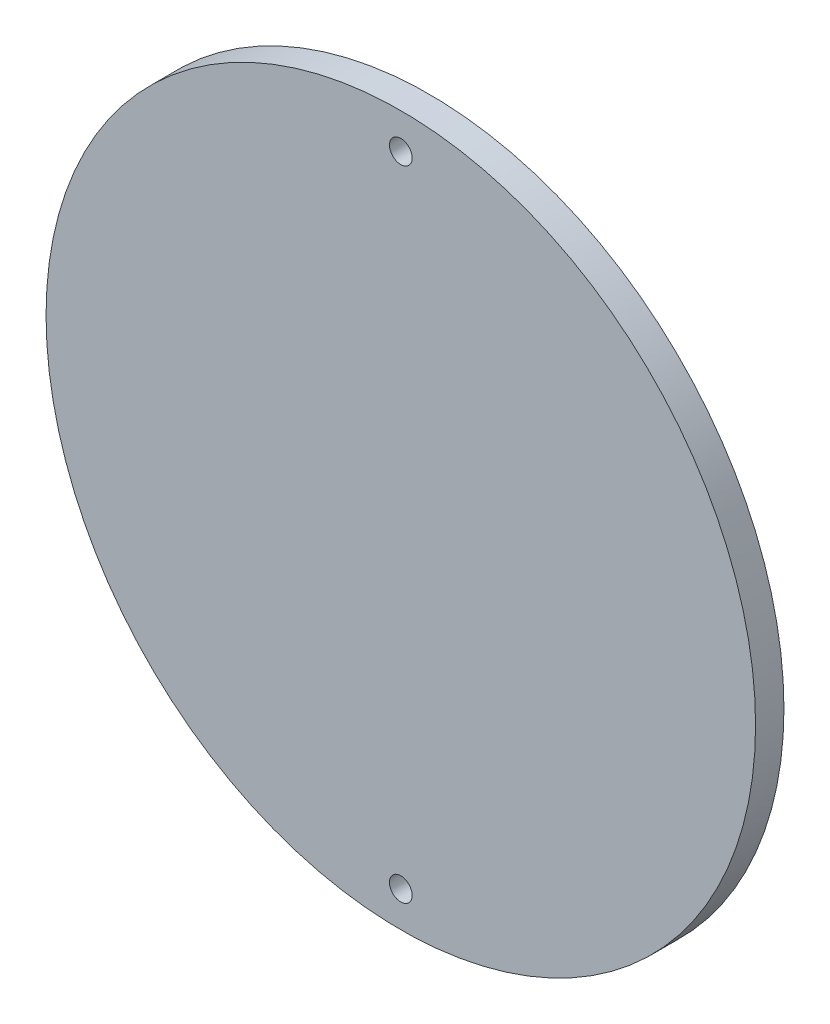
ISO-10303-21;
HEADER;
FILE_DESCRIPTION(('STEP AP214'),'2;1');
FILE_NAME('part.step','',(''),(''),'','','');
FILE_SCHEMA(('AUTOMOTIVE_DESIGN { 1 0 10303 214 1 1 1 1 }'));
ENDSEC;
DATA;
#1=APPLICATION_CONTEXT('core data for automotive mechanical design processes');
#2=APPLICATION_PROTOCOL_DEFINITION('international standard','automotive_design',2000,#1);
#3=PRODUCT_CONTEXT('',#1,'mechanical');
#4=PRODUCT('Part','Part','',(#3));
#5=PRODUCT_RELATED_PRODUCT_CATEGORY('part','',(#4));
#6=PRODUCT_DEFINITION_FORMATION('','',#4);
#7=PRODUCT_DEFINITION_CONTEXT('part definition',#1,'design');
#8=PRODUCT_DEFINITION('design','',#6,#7);
#9=PRODUCT_DEFINITION_SHAPE('','',#8);
#10=(LENGTH_UNIT() NAMED_UNIT(*) SI_UNIT(.MILLI.,.METRE.));
#11=(NAMED_UNIT(*) PLANE_ANGLE_UNIT() SI_UNIT($,.RADIAN.));
#12=(NAMED_UNIT(*) SI_UNIT($,.STERADIAN.) SOLID_ANGLE_UNIT());
#13=UNCERTAINTY_MEASURE_WITH_UNIT(LENGTH_MEASURE(1.E-05),#10,'distance_accuracy_value','');
#14=(GEOMETRIC_REPRESENTATION_CONTEXT(3) GLOBAL_UNCERTAINTY_ASSIGNED_CONTEXT((#13)) GLOBAL_UNIT_ASSIGNED_CONTEXT((#10,
#11,#12)) REPRESENTATION_CONTEXT('',''));
#15=CARTESIAN_POINT('',(0.,0.,0.));
#16=DIRECTION('',(0.,0.,1.));
#17=DIRECTION('',(1.,0.,0.));
#18=AXIS2_PLACEMENT_3D('',#15,#16,#17);
#19=CARTESIAN_POINT('',(0.,0.,4.));
#20=DIRECTION('',(0.,0.,1.));
#21=DIRECTION('',(1.,0.,0.));
#22=AXIS2_PLACEMENT_3D('',#19,#20,#21);
#23=PLANE('',#22);
#24=CARTESIAN_POINT('',(0.,45.,4.));
#25=DIRECTION('',(0.,0.,1.));
#26=DIRECTION('',(1.,0.,0.));
#27=AXIS2_PLACEMENT_3D('',#24,#25,#26);
#28=CIRCLE('',#27,1.6);
#29=CARTESIAN_POINT('',(1.6,45.,4.));
#30=VERTEX_POINT('',#29);
#31=EDGE_CURVE('E42',#30,#30,#28,.T.);
#32=ORIENTED_EDGE('',*,*,#31,.F.);
#33=EDGE_LOOP('',(#32));
#34=FACE_BOUND('',#33,.T.);
#35=CARTESIAN_POINT('',(0.,0.,4.));
#36=DIRECTION('',(0.,0.,1.));
#37=DIRECTION('',(1.,0.,0.));
#38=AXIS2_PLACEMENT_3D('',#35,#36,#37);
#39=CIRCLE('',#38,50.);
#40=CARTESIAN_POINT('',(50.,0.,4.));
#41=VERTEX_POINT('',#40);
#42=EDGE_CURVE('E10',#41,#41,#39,.T.);
#43=ORIENTED_EDGE('',*,*,#42,.T.);
#44=EDGE_LOOP('',(#43));
#45=FACE_BOUND('',#44,.T.);
#46=CARTESIAN_POINT('',(0.,-45.,4.));
#47=DIRECTION('',(0.,0.,1.));
#48=DIRECTION('',(1.,0.,0.));
#49=AXIS2_PLACEMENT_3D('',#46,#47,#48);
#50=CIRCLE('',#49,1.6);
#51=CARTESIAN_POINT('',(1.6,-45.,4.));
#52=VERTEX_POINT('',#51);
#53=EDGE_CURVE('E47',#52,#52,#50,.T.);
#54=ORIENTED_EDGE('',*,*,#53,.F.);
#55=EDGE_LOOP('',(#54));
#56=FACE_BOUND('',#55,.T.);
#57=ADVANCED_FACE('F31',(#34,#45,#56),#23,.T.);
#58=CARTESIAN_POINT('',(0.,0.,0.));
#59=DIRECTION('',(0.,0.,1.));
#60=DIRECTION('',(1.,0.,0.));
#61=AXIS2_PLACEMENT_3D('',#58,#59,#60);
#62=PLANE('',#61);
#63=CARTESIAN_POINT('',(0.,0.,0.));
#64=DIRECTION('',(0.,0.,1.));
#65=DIRECTION('',(1.,0.,0.));
#66=AXIS2_PLACEMENT_3D('',#63,#64,#65);
#67=CIRCLE('',#66,50.);
#68=CARTESIAN_POINT('',(50.,0.,0.));
#69=VERTEX_POINT('',#68);
#70=EDGE_CURVE('E35',#69,#69,#67,.T.);
#71=ORIENTED_EDGE('',*,*,#70,.F.);
#72=EDGE_LOOP('',(#71));
#73=FACE_BOUND('',#72,.T.);
#74=CARTESIAN_POINT('',(0.,45.,0.));
#75=DIRECTION('',(0.,0.,1.));
#76=DIRECTION('',(1.,0.,0.));
#77=AXIS2_PLACEMENT_3D('',#74,#75,#76);
#78=CIRCLE('',#77,1.6);
#79=CARTESIAN_POINT('',(1.6,45.,0.));
#80=VERTEX_POINT('',#79);
#81=EDGE_CURVE('E44',#80,#80,#78,.T.);
#82=ORIENTED_EDGE('',*,*,#81,.T.);
#83=EDGE_LOOP('',(#82));
#84=FACE_BOUND('',#83,.T.);
#85=CARTESIAN_POINT('',(0.,-45.,0.));
#86=DIRECTION('',(0.,0.,1.));
#87=DIRECTION('',(1.,0.,0.));
#88=AXIS2_PLACEMENT_3D('',#85,#86,#87);
#89=CIRCLE('',#88,1.6);
#90=CARTESIAN_POINT('',(1.6,-45.,0.));
#91=VERTEX_POINT('',#90);
#92=EDGE_CURVE('E50',#91,#91,#89,.T.);
#93=ORIENTED_EDGE('',*,*,#92,.T.);
#94=EDGE_LOOP('',(#93));
#95=FACE_BOUND('',#94,.T.);
#96=ADVANCED_FACE('F60',(#73,#84,#95),#62,.F.);
#97=CARTESIAN_POINT('',(0.,0.,4.));
#98=DIRECTION('',(0.,0.,-1.));
#99=DIRECTION('',(-1.,0.,0.));
#100=AXIS2_PLACEMENT_3D('',#97,#98,#99);
#101=CYLINDRICAL_SURFACE('',#100,50.);
#102=ORIENTED_EDGE('',*,*,#42,.F.);
#103=EDGE_LOOP('',(#102));
#104=FACE_BOUND('',#103,.T.);
#105=ORIENTED_EDGE('',*,*,#70,.T.);
#106=EDGE_LOOP('',(#105));
#107=FACE_BOUND('',#106,.T.);
#108=ADVANCED_FACE('F33',(#104,#107),#101,.T.);
#109=CARTESIAN_POINT('',(0.,45.,4.));
#110=DIRECTION('',(0.,0.,-1.));
#111=DIRECTION('',(-1.,0.,0.));
#112=AXIS2_PLACEMENT_3D('',#109,#110,#111);
#113=CYLINDRICAL_SURFACE('',#112,1.6);
#114=ORIENTED_EDGE('',*,*,#31,.T.);
#115=EDGE_LOOP('',(#114));
#116=FACE_BOUND('',#115,.T.);
#117=ORIENTED_EDGE('',*,*,#81,.F.);
#118=EDGE_LOOP('',(#117));
#119=FACE_BOUND('',#118,.T.);
#120=ADVANCED_FACE('F69',(#116,#119),#113,.F.);
#121=CARTESIAN_POINT('',(0.,-45.,4.));
#122=DIRECTION('',(0.,0.,-1.));
#123=DIRECTION('',(-1.,0.,0.));
#124=AXIS2_PLACEMENT_3D('',#121,#122,#123);
#125=CYLINDRICAL_SURFACE('',#124,1.6);
#126=ORIENTED_EDGE('',*,*,#53,.T.);
#127=EDGE_LOOP('',(#126));
#128=FACE_BOUND('',#127,.T.);
#129=ORIENTED_EDGE('',*,*,#92,.F.);
#130=EDGE_LOOP('',(#129));
#131=FACE_BOUND('',#130,.T.);
#132=ADVANCED_FACE('F56',(#128,#131),#125,.F.);
#133=CLOSED_SHELL('',(#57,#96,#108,#120,#132));
#134=MANIFOLD_SOLID_BREP('B2',#133);
#135=ADVANCED_BREP_SHAPE_REPRESENTATION('',(#18,#134),#14);
#136=SHAPE_DEFINITION_REPRESENTATION(#9,#135);
ENDSEC;
END-ISO-10303-21;
